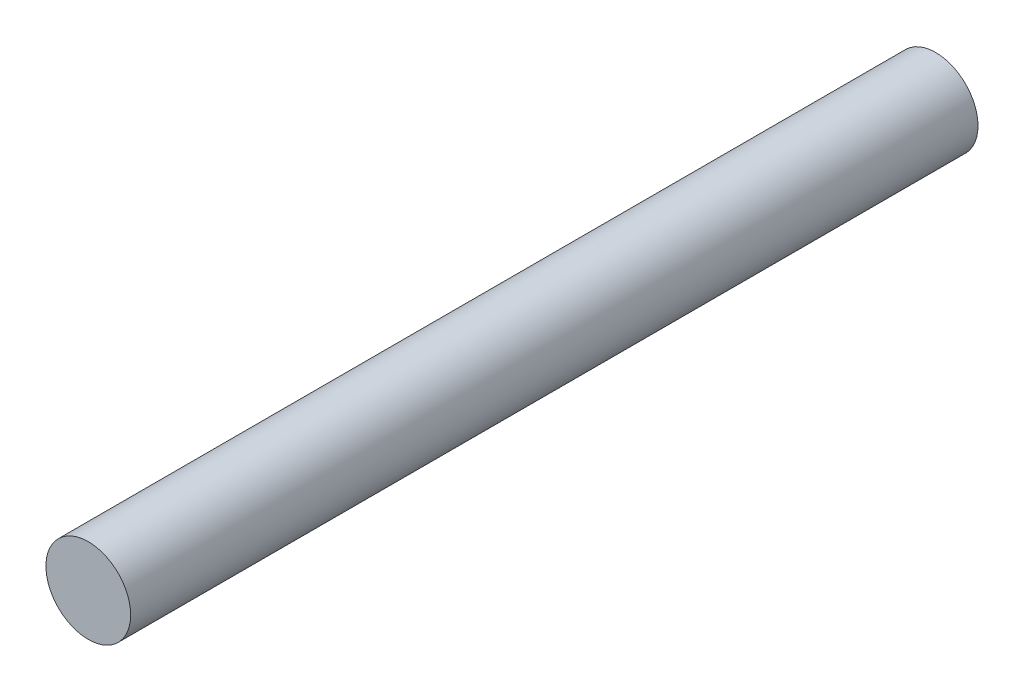
ISO-10303-21;
HEADER;
FILE_DESCRIPTION(('STEP AP214'),'2;1');
FILE_NAME('part.step','',(''),(''),'','','');
FILE_SCHEMA(('AUTOMOTIVE_DESIGN { 1 0 10303 214 1 1 1 1 }'));
ENDSEC;
DATA;
#1=APPLICATION_CONTEXT('core data for automotive mechanical design processes');
#2=APPLICATION_PROTOCOL_DEFINITION('international standard','automotive_design',2000,#1);
#3=PRODUCT_CONTEXT('',#1,'mechanical');
#4=PRODUCT('Part','Part','',(#3));
#5=PRODUCT_RELATED_PRODUCT_CATEGORY('part','',(#4));
#6=PRODUCT_DEFINITION_FORMATION('','',#4);
#7=PRODUCT_DEFINITION_CONTEXT('part definition',#1,'design');
#8=PRODUCT_DEFINITION('design','',#6,#7);
#9=PRODUCT_DEFINITION_SHAPE('','',#8);
#10=(LENGTH_UNIT() NAMED_UNIT(*) SI_UNIT(.MILLI.,.METRE.));
#11=(NAMED_UNIT(*) PLANE_ANGLE_UNIT() SI_UNIT($,.RADIAN.));
#12=(NAMED_UNIT(*) SI_UNIT($,.STERADIAN.) SOLID_ANGLE_UNIT());
#13=UNCERTAINTY_MEASURE_WITH_UNIT(LENGTH_MEASURE(1.E-05),#10,'distance_accuracy_value','');
#14=(GEOMETRIC_REPRESENTATION_CONTEXT(3) GLOBAL_UNCERTAINTY_ASSIGNED_CONTEXT((#13)) GLOBAL_UNIT_ASSIGNED_CONTEXT((#10,
#11,#12)) REPRESENTATION_CONTEXT('',''));
#15=CARTESIAN_POINT('',(0.,0.,0.));
#16=DIRECTION('',(0.,0.,1.));
#17=DIRECTION('',(1.,0.,0.));
#18=AXIS2_PLACEMENT_3D('',#15,#16,#17);
#19=CARTESIAN_POINT('',(-941.662974387242,304.387338025483,-10.));
#20=DIRECTION('',(0.,0.,1.));
#21=DIRECTION('',(1.,0.,0.));
#22=AXIS2_PLACEMENT_3D('',#19,#20,#21);
#23=CYLINDRICAL_SURFACE('',#22,0.999999999999945);
#24=CARTESIAN_POINT('',(-941.662974387242,304.387338025483,-10.));
#25=DIRECTION('',(0.,0.,1.));
#26=DIRECTION('',(1.,0.,0.));
#27=AXIS2_PLACEMENT_3D('',#24,#25,#26);
#28=CIRCLE('',#27,0.999999999999945);
#29=CARTESIAN_POINT('',(-940.662974387242,304.387338025483,-10.));
#30=VERTEX_POINT('',#29);
#31=EDGE_CURVE('E10',#30,#30,#28,.T.);
#32=ORIENTED_EDGE('',*,*,#31,.T.);
#33=EDGE_LOOP('',(#32));
#34=FACE_BOUND('',#33,.T.);
#35=CARTESIAN_POINT('',(-941.662974387242,304.387338025483,10.));
#36=DIRECTION('',(0.,0.,1.));
#37=DIRECTION('',(1.,0.,0.));
#38=AXIS2_PLACEMENT_3D('',#35,#36,#37);
#39=CIRCLE('',#38,0.999999999999945);
#40=CARTESIAN_POINT('',(-940.662974387242,304.387338025483,10.));
#41=VERTEX_POINT('',#40);
#42=EDGE_CURVE('E37',#41,#41,#39,.T.);
#43=ORIENTED_EDGE('',*,*,#42,.F.);
#44=EDGE_LOOP('',(#43));
#45=FACE_BOUND('',#44,.T.);
#46=ADVANCED_FACE('F31',(#34,#45),#23,.T.);
#47=CARTESIAN_POINT('',(-941.662974387242,304.387338025483,-10.));
#48=DIRECTION('',(0.,0.,1.));
#49=DIRECTION('',(1.,0.,0.));
#50=AXIS2_PLACEMENT_3D('',#47,#48,#49);
#51=PLANE('',#50);
#52=ORIENTED_EDGE('',*,*,#31,.F.);
#53=EDGE_LOOP('',(#52));
#54=FACE_BOUND('',#53,.T.);
#55=ADVANCED_FACE('F46',(#54),#51,.F.);
#56=CARTESIAN_POINT('',(-941.662974387242,304.387338025483,10.));
#57=DIRECTION('',(0.,0.,1.));
#58=DIRECTION('',(1.,0.,0.));
#59=AXIS2_PLACEMENT_3D('',#56,#57,#58);
#60=PLANE('',#59);
#61=ORIENTED_EDGE('',*,*,#42,.T.);
#62=EDGE_LOOP('',(#61));
#63=FACE_BOUND('',#62,.T.);
#64=ADVANCED_FACE('F43',(#63),#60,.T.);
#65=CLOSED_SHELL('',(#46,#55,#64));
#66=MANIFOLD_SOLID_BREP('B2',#65);
#67=ADVANCED_BREP_SHAPE_REPRESENTATION('',(#18,#66),#14);
#68=SHAPE_DEFINITION_REPRESENTATION(#9,#67);
ENDSEC;
END-ISO-10303-21;
